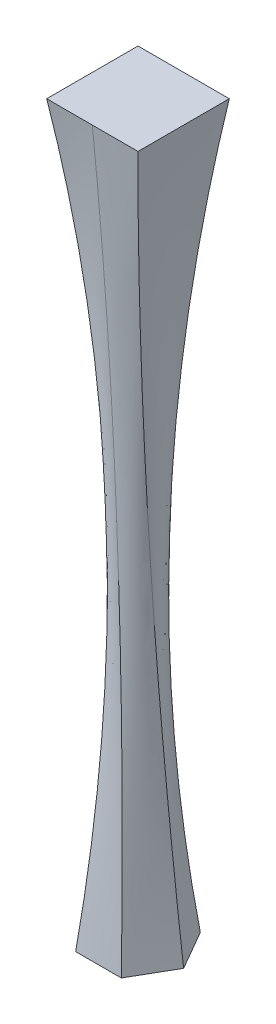
ISO-10303-21;
HEADER;
FILE_DESCRIPTION(('STEP AP214'),'2;1');
FILE_NAME('part.step','',(''),(''),'','','');
FILE_SCHEMA(('AUTOMOTIVE_DESIGN { 1 0 10303 214 1 1 1 1 }'));
ENDSEC;
DATA;
#1=APPLICATION_CONTEXT('core data for automotive mechanical design processes');
#2=APPLICATION_PROTOCOL_DEFINITION('international standard','automotive_design',2000,#1);
#3=PRODUCT_CONTEXT('',#1,'mechanical');
#4=PRODUCT('Part','Part','',(#3));
#5=PRODUCT_RELATED_PRODUCT_CATEGORY('part','',(#4));
#6=PRODUCT_DEFINITION_FORMATION('','',#4);
#7=PRODUCT_DEFINITION_CONTEXT('part definition',#1,'design');
#8=PRODUCT_DEFINITION('design','',#6,#7);
#9=PRODUCT_DEFINITION_SHAPE('','',#8);
#10=(LENGTH_UNIT() NAMED_UNIT(*) SI_UNIT(.MILLI.,.METRE.));
#11=(NAMED_UNIT(*) PLANE_ANGLE_UNIT() SI_UNIT($,.RADIAN.));
#12=(NAMED_UNIT(*) SI_UNIT($,.STERADIAN.) SOLID_ANGLE_UNIT());
#13=UNCERTAINTY_MEASURE_WITH_UNIT(LENGTH_MEASURE(1.E-05),#10,'distance_accuracy_value','');
#14=(GEOMETRIC_REPRESENTATION_CONTEXT(3) GLOBAL_UNCERTAINTY_ASSIGNED_CONTEXT((#13)) GLOBAL_UNIT_ASSIGNED_CONTEXT((#10,
#11,#12)) REPRESENTATION_CONTEXT('',''));
#15=CARTESIAN_POINT('',(0.,0.,0.));
#16=DIRECTION('',(0.,0.,1.));
#17=DIRECTION('',(1.,0.,0.));
#18=AXIS2_PLACEMENT_3D('',#15,#16,#17);
#19=CARTESIAN_POINT('',(0.,200.,0.));
#20=DIRECTION('',(0.,1.,0.));
#21=DIRECTION('',(0.,0.,1.));
#22=AXIS2_PLACEMENT_3D('',#19,#20,#21);
#23=PLANE('',#22);
#24=DIRECTION('',(0.,0.,-1.));
#25=VECTOR('',#24,1.);
#26=CARTESIAN_POINT('',(25.,200.,-25.));
#27=LINE('',#26,#25);
#28=CARTESIAN_POINT('',(25.,200.,25.));
#29=VERTEX_POINT('',#28);
#30=CARTESIAN_POINT('',(25.,200.,-25.));
#31=VERTEX_POINT('',#30);
#32=EDGE_CURVE('E132',#29,#31,#27,.T.);
#33=ORIENTED_EDGE('',*,*,#32,.T.);
#34=DIRECTION('',(-1.,0.,0.));
#35=VECTOR('',#34,1.);
#36=CARTESIAN_POINT('',(-25.,200.,-25.));
#37=LINE('',#36,#35);
#38=CARTESIAN_POINT('',(-1.59594559789866E-13,200.,-25.));
#39=VERTEX_POINT('',#38);
#40=EDGE_CURVE('E12',#31,#39,#37,.T.);
#41=ORIENTED_EDGE('',*,*,#40,.T.);
#42=CARTESIAN_POINT('',(-25.,200.,-25.));
#43=VERTEX_POINT('',#42);
#44=EDGE_CURVE('E57',#39,#43,#37,.T.);
#45=ORIENTED_EDGE('',*,*,#44,.T.);
#46=DIRECTION('',(0.,0.,1.));
#47=VECTOR('',#46,1.);
#48=CARTESIAN_POINT('',(-25.,200.,-25.));
#49=LINE('',#48,#47);
#50=CARTESIAN_POINT('',(-25.,200.,25.));
#51=VERTEX_POINT('',#50);
#52=EDGE_CURVE('E260',#43,#51,#49,.T.);
#53=ORIENTED_EDGE('',*,*,#52,.T.);
#54=DIRECTION('',(1.,0.,0.));
#55=VECTOR('',#54,1.);
#56=CARTESIAN_POINT('',(-25.,200.,25.));
#57=LINE('',#56,#55);
#58=CARTESIAN_POINT('',(0.,200.,25.));
#59=VERTEX_POINT('',#58);
#60=EDGE_CURVE('E65',#51,#59,#57,.T.);
#61=ORIENTED_EDGE('',*,*,#60,.T.);
#62=EDGE_CURVE('E135',#59,#29,#57,.T.);
#63=ORIENTED_EDGE('',*,*,#62,.T.);
#64=EDGE_LOOP('',(#33,#41,#45,#53,#61,#63));
#65=FACE_BOUND('',#64,.T.);
#66=ADVANCED_FACE('F47',(#65),#23,.T.);
#67=CARTESIAN_POINT('',(0.,-200.,0.));
#68=DIRECTION('',(0.,1.,0.));
#69=DIRECTION('',(0.,0.,1.));
#70=AXIS2_PLACEMENT_3D('',#67,#68,#69);
#71=PLANE('',#70);
#72=DIRECTION('',(0.499999999999995,0.,-0.866025403784442));
#73=VECTOR('',#72,1.);
#74=CARTESIAN_POINT('',(12.5000000000003,-200.,21.6506350946108));
#75=LINE('',#74,#73);
#76=CARTESIAN_POINT('',(12.5000000000003,-200.,21.6506350946108));
#77=VERTEX_POINT('',#76);
#78=CARTESIAN_POINT('',(25.,-200.,0.));
#79=VERTEX_POINT('',#78);
#80=EDGE_CURVE('E107',#77,#79,#75,.T.);
#81=ORIENTED_EDGE('',*,*,#80,.F.);
#82=DIRECTION('',(1.,0.,0.));
#83=VECTOR('',#82,1.);
#84=CARTESIAN_POINT('',(-12.4999999999998,-200.,21.6506350946111));
#85=LINE('',#84,#83);
#86=CARTESIAN_POINT('',(-12.4999999999998,-200.,21.6506350946111));
#87=VERTEX_POINT('',#86);
#88=EDGE_CURVE('E211',#87,#77,#85,.T.);
#89=ORIENTED_EDGE('',*,*,#88,.F.);
#90=DIRECTION('',(0.500000000000007,0.,0.866025403784435));
#91=VECTOR('',#90,1.);
#92=CARTESIAN_POINT('',(-25.,-200.,1.74574066942157E-13));
#93=LINE('',#92,#91);
#94=CARTESIAN_POINT('',(-25.,-200.,1.74574066942157E-13));
#95=VERTEX_POINT('',#94);
#96=EDGE_CURVE('E215',#95,#87,#93,.T.);
#97=ORIENTED_EDGE('',*,*,#96,.F.);
#98=DIRECTION('',(-0.499999999999995,0.,0.866025403784442));
#99=VECTOR('',#98,1.);
#100=CARTESIAN_POINT('',(-12.5000000000001,-200.,-21.6506350946109));
#101=LINE('',#100,#99);
#102=CARTESIAN_POINT('',(-12.5000000000001,-200.,-21.6506350946109));
#103=VERTEX_POINT('',#102);
#104=EDGE_CURVE('E319',#103,#95,#101,.T.);
#105=ORIENTED_EDGE('',*,*,#104,.F.);
#106=DIRECTION('',(-1.,0.,0.));
#107=VECTOR('',#106,1.);
#108=CARTESIAN_POINT('',(12.5,-200.,-21.650635094611));
#109=LINE('',#108,#107);
#110=CARTESIAN_POINT('',(12.5,-200.,-21.650635094611));
#111=VERTEX_POINT('',#110);
#112=EDGE_CURVE('E110',#111,#103,#109,.T.);
#113=ORIENTED_EDGE('',*,*,#112,.F.);
#114=DIRECTION('',(-0.500000000000001,0.,-0.866025403784438));
#115=VECTOR('',#114,1.);
#116=CARTESIAN_POINT('',(25.,-200.,0.));
#117=LINE('',#116,#115);
#118=EDGE_CURVE('E103',#79,#111,#117,.T.);
#119=ORIENTED_EDGE('',*,*,#118,.F.);
#120=EDGE_LOOP('',(#81,#89,#97,#105,#113,#119));
#121=FACE_BOUND('',#120,.T.);
#122=ADVANCED_FACE('F106',(#121),#71,.F.);
#123=CARTESIAN_POINT('',(12.5,-200.,-21.650635094611));
#124=CARTESIAN_POINT('',(8.92320177032487,-133.199819300362,-11.4260780027468));
#125=CARTESIAN_POINT('',(7.42464819524794,0.104334544871534,-1.75837751612293));
#126=CARTESIAN_POINT('',(17.2565351036582,133.466847366305,-13.6589879396728));
#127=CARTESIAN_POINT('',(25.,200.,-25.));
#128=CARTESIAN_POINT('',(4.1666666666666,-200.,-21.650635094611));
#129=CARTESIAN_POINT('',(3.62858929019053,-133.252205813714,-12.6045499883517));
#130=CARTESIAN_POINT('',(7.61149610460513,0.15672114157544,-7.90531686988969));
#131=CARTESIAN_POINT('',(11.9619226235239,133.414460852952,-14.8374599252777));
#132=CARTESIAN_POINT('',(16.6666666666666,200.,-25.));
#133=CARTESIAN_POINT('',(-4.16666666666675,-200.,-21.6506350946109));
#134=CARTESIAN_POINT('',(-1.6660231899438,-133.304592327067,-13.7830219739565));
#135=CARTESIAN_POINT('',(4.27497381541747,0.209107738279319,-10.772388554184));
#136=CARTESIAN_POINT('',(6.66731014338952,133.3620743396,-16.0159319108826));
#137=CARTESIAN_POINT('',(8.33333333333323,200.,-25.));
#138=CARTESIAN_POINT('',(-12.5000000000001,-200.,-21.6506350946109));
#139=CARTESIAN_POINT('',(-6.96063567007813,-133.356978840419,-14.9614939595614));
#140=CARTESIAN_POINT('',(0.671714285350042,0.261494334983225,-8.83316013033138));
#141=CARTESIAN_POINT('',(1.37269766325516,133.309687826248,-17.1944038964875));
#142=CARTESIAN_POINT('',(-1.59594559789866E-13,200.,-25.));
#143=B_SPLINE_SURFACE_WITH_KNOTS('',3,3,((#123,#124,#125,#126,#127),(#128,#129,#130,#131,#132),
(#133,#134,#135,#136,#137),(#138,#139,#140,#141,#142)),.UNSPECIFIED.,.F.,.F.,.F.,(4,4),(4,1,4),
(0.,1.),(0.,0.499554033873019,1.),.UNSPECIFIED.);
#144=CARTESIAN_POINT('',(-12.5000000000001,-200.,-21.6506350946109));
#145=CARTESIAN_POINT('',(-6.96063567007813,-133.356978840419,-14.9614939595614));
#146=CARTESIAN_POINT('',(0.671714285350042,0.261494334983225,-8.83316013033138));
#147=CARTESIAN_POINT('',(1.37269766325516,133.309687826248,-17.1944038964875));
#148=CARTESIAN_POINT('',(-1.59594559789866E-13,200.,-25.));
#149=B_SPLINE_CURVE_WITH_KNOTS('',3,(#144,#145,#146,#147,#148),.UNSPECIFIED.,.F.,.F.,(4,1,4),
(0.,0.499554033873019,1.),.UNSPECIFIED.);
#150=EDGE_CURVE('E302',#103,#39,#149,.T.);
#151=CARTESIAN_POINT('',(12.5,-200.,-21.650635094611));
#152=CARTESIAN_POINT('',(8.92320177032487,-133.199819300362,-11.4260780027468));
#153=CARTESIAN_POINT('',(7.42464819524794,0.104334544871534,-1.75837751612293));
#154=CARTESIAN_POINT('',(17.2565351036582,133.466847366305,-13.6589879396728));
#155=CARTESIAN_POINT('',(25.,200.,-25.));
#156=B_SPLINE_CURVE_WITH_KNOTS('',3,(#151,#152,#153,#154,#155),.UNSPECIFIED.,.F.,.F.,(4,1,4),
(0.,0.499554033873019,1.),.UNSPECIFIED.);
#157=EDGE_CURVE('E153',#31,#111,#156,.F.);
#158=ORIENTED_EDGE('',*,*,#112,.T.);
#159=ORIENTED_EDGE('',*,*,#150,.T.);
#160=ORIENTED_EDGE('',*,*,#40,.F.);
#161=ORIENTED_EDGE('',*,*,#157,.T.);
#162=EDGE_LOOP('',(#158,#159,#160,#161));
#163=FACE_BOUND('',#162,.T.);
#164=ADVANCED_FACE('F278',(#163),#143,.T.);
#165=CARTESIAN_POINT('',(-12.5000000000001,-200.,-21.6506350946109));
#166=CARTESIAN_POINT('',(-6.96063567007813,-133.356978840419,-14.9614939595614));
#167=CARTESIAN_POINT('',(0.671714285350042,0.261494334983225,-8.83316013033138));
#168=CARTESIAN_POINT('',(1.37269766325516,133.309687826248,-17.1944038964875));
#169=CARTESIAN_POINT('',(-1.59594559789866E-13,200.,-25.));
#170=CARTESIAN_POINT('',(-16.6666666666667,-200.,-14.4337567297405));
#171=CARTESIAN_POINT('',(-9.93339918164415,-133.29932682143,-9.76746169341948));
#172=CARTESIAN_POINT('',(-3.86698440038327,0.203842224265202,-10.8651074627243));
#173=CARTESIAN_POINT('',(-4.37784362608862,133.367339845236,-16.8116238735924));
#174=CARTESIAN_POINT('',(-8.33333333333344,200.,-25.));
#175=CARTESIAN_POINT('',(-20.8333333333334,-200.,-7.21687836487019));
#176=CARTESIAN_POINT('',(-12.9061626932102,-133.241674802442,-4.57342942727751));
#177=CARTESIAN_POINT('',(-7.3269194625746,0.146190113547194,-8.20579286150414));
#178=CARTESIAN_POINT('',(-10.1283849154324,133.424991864225,-16.4288438506974));
#179=CARTESIAN_POINT('',(-16.6666666666667,200.,-25.));
#180=CARTESIAN_POINT('',(-25.,-200.,1.76941794549634E-13));
#181=CARTESIAN_POINT('',(-15.8789262047762,-133.184022783453,0.620602838864446));
#182=CARTESIAN_POINT('',(-6.75784515333883,0.0885380028291718,-2.91232697947338));
#183=CARTESIAN_POINT('',(-15.8789262047762,133.482643883213,-16.0460638278023));
#184=CARTESIAN_POINT('',(-25.,200.,-25.));
#185=B_SPLINE_SURFACE_WITH_KNOTS('',3,3,((#165,#166,#167,#168,#169),(#170,#171,#172,#173,#174),
(#175,#176,#177,#178,#179),(#180,#181,#182,#183,#184)),.UNSPECIFIED.,.F.,.F.,.F.,(4,4),(4,1,4),
(0.,1.),(0.,0.499554033873019,1.),.UNSPECIFIED.);
#186=CARTESIAN_POINT('',(-25.,-200.,1.76941794549634E-13));
#187=CARTESIAN_POINT('',(-15.8789262047762,-133.184022783453,0.620602838864446));
#188=CARTESIAN_POINT('',(-6.75784515333883,0.0885380028291718,-2.91232697947338));
#189=CARTESIAN_POINT('',(-15.8789262047762,133.482643883213,-16.0460638278023));
#190=CARTESIAN_POINT('',(-25.,200.,-25.));
#191=B_SPLINE_CURVE_WITH_KNOTS('',3,(#186,#187,#188,#189,#190),.UNSPECIFIED.,.F.,.F.,(4,1,4),
(0.,0.499554033873019,1.),.UNSPECIFIED.);
#192=EDGE_CURVE('E309',#95,#43,#191,.T.);
#193=ORIENTED_EDGE('',*,*,#104,.T.);
#194=ORIENTED_EDGE('',*,*,#192,.T.);
#195=ORIENTED_EDGE('',*,*,#44,.F.);
#196=ORIENTED_EDGE('',*,*,#150,.F.);
#197=EDGE_LOOP('',(#193,#194,#195,#196));
#198=FACE_BOUND('',#197,.T.);
#199=ADVANCED_FACE('F167',(#198),#185,.T.);
#200=CARTESIAN_POINT('',(25.,-200.,0.));
#201=CARTESIAN_POINT('',(15.8789262047762,-133.184022783453,-0.620602838864391));
#202=CARTESIAN_POINT('',(6.75784515333886,0.0885380028291718,2.91232697947328));
#203=CARTESIAN_POINT('',(15.8789262047762,133.482643883213,16.0460638278023));
#204=CARTESIAN_POINT('',(25.,200.,25.));
#205=CARTESIAN_POINT('',(20.8333333333333,-200.,-7.21687836487033));
#206=CARTESIAN_POINT('',(13.5603513932924,-133.189288289089,-4.22242789349185));
#207=CARTESIAN_POINT('',(11.4801175861354,0.0938035168433017,1.57230538125624));
#208=CARTESIAN_POINT('',(16.3381291710702,133.477378377577,6.1443799053106));
#209=CARTESIAN_POINT('',(25.,200.,8.33333333333333));
#210=CARTESIAN_POINT('',(16.6666666666666,-200.,-14.4337567297407));
#211=CARTESIAN_POINT('',(11.2417765818086,-133.194553794726,-7.8242529481193));
#212=CARTESIAN_POINT('',(11.6002561968452,0.0990690308574178,-1.17911048110144));
#213=CARTESIAN_POINT('',(16.7973321373642,133.472112871941,-3.75730401718108));
#214=CARTESIAN_POINT('',(25.,200.,-8.33333333333333));
#215=CARTESIAN_POINT('',(12.5,-200.,-21.650635094611));
#216=CARTESIAN_POINT('',(8.92320177032487,-133.199819300362,-11.4260780027468));
#217=CARTESIAN_POINT('',(7.42464819524794,0.104334544871534,-1.75837751612293));
#218=CARTESIAN_POINT('',(17.2565351036582,133.466847366305,-13.6589879396728));
#219=CARTESIAN_POINT('',(25.,200.,-25.));
#220=B_SPLINE_SURFACE_WITH_KNOTS('',3,3,((#200,#201,#202,#203,#204),(#205,#206,#207,#208,#209),
(#210,#211,#212,#213,#214),(#215,#216,#217,#218,#219)),.UNSPECIFIED.,.F.,.F.,.F.,(4,4),(4,1,4),
(0.,1.),(0.,0.499554033873019,1.),.UNSPECIFIED.);
#221=CARTESIAN_POINT('',(25.,-200.,0.));
#222=CARTESIAN_POINT('',(15.8789262047762,-133.184022783453,-0.620602838864391));
#223=CARTESIAN_POINT('',(6.75784515333886,0.0885380028291718,2.91232697947328));
#224=CARTESIAN_POINT('',(15.8789262047762,133.482643883213,16.0460638278023));
#225=CARTESIAN_POINT('',(25.,200.,25.));
#226=B_SPLINE_CURVE_WITH_KNOTS('',3,(#221,#222,#223,#224,#225),.UNSPECIFIED.,.F.,.F.,(4,1,4),
(0.,0.499554033873019,1.),.UNSPECIFIED.);
#227=EDGE_CURVE('E123',#79,#29,#226,.T.);
#228=ORIENTED_EDGE('',*,*,#118,.T.);
#229=ORIENTED_EDGE('',*,*,#157,.F.);
#230=ORIENTED_EDGE('',*,*,#32,.F.);
#231=ORIENTED_EDGE('',*,*,#227,.F.);
#232=EDGE_LOOP('',(#228,#229,#230,#231));
#233=FACE_BOUND('',#232,.T.);
#234=ADVANCED_FACE('F131',(#233),#220,.T.);
#235=CARTESIAN_POINT('',(-25.,-200.,1.74574066942157E-13));
#236=CARTESIAN_POINT('',(-15.8789262047762,-133.184022783453,0.620602838864444));
#237=CARTESIAN_POINT('',(-6.75784515333882,0.0885380028291718,-2.91232697947338));
#238=CARTESIAN_POINT('',(-15.8789262047762,133.482643883213,-16.0460638278023));
#239=CARTESIAN_POINT('',(-25.,200.,-25.));
#240=CARTESIAN_POINT('',(-20.8333333333333,-200.,7.21687836487048));
#241=CARTESIAN_POINT('',(-13.5603513932924,-133.189288289089,4.22242789349189));
#242=CARTESIAN_POINT('',(-11.4801175861354,0.0938035168433017,-1.57230538125634));
#243=CARTESIAN_POINT('',(-16.3381291710702,133.477378377577,-6.14437990531065));
#244=CARTESIAN_POINT('',(-25.,200.,-8.33333333333333));
#245=CARTESIAN_POINT('',(-16.6666666666665,-200.,14.4337567297408));
#246=CARTESIAN_POINT('',(-11.2417765818086,-133.194553794726,7.82425294811934));
#247=CARTESIAN_POINT('',(-11.6002561968452,0.0990690308574178,1.17911048110136));
#248=CARTESIAN_POINT('',(-16.7973321373642,133.472112871941,3.75730401718104));
#249=CARTESIAN_POINT('',(-25.,200.,8.33333333333333));
#250=CARTESIAN_POINT('',(-12.4999999999998,-200.,21.6506350946111));
#251=CARTESIAN_POINT('',(-8.9232017703248,-133.199819300362,11.4260780027468));
#252=CARTESIAN_POINT('',(-7.424648195248,0.104334544871534,1.75837751612287));
#253=CARTESIAN_POINT('',(-17.2565351036583,133.466847366305,13.6589879396727));
#254=CARTESIAN_POINT('',(-25.,200.,25.));
#255=B_SPLINE_SURFACE_WITH_KNOTS('',3,3,((#235,#236,#237,#238,#239),(#240,#241,#242,#243,#244),
(#245,#246,#247,#248,#249),(#250,#251,#252,#253,#254)),.UNSPECIFIED.,.F.,.F.,.F.,(4,4),(4,1,4),
(0.,1.),(0.,0.499554033873019,1.),.UNSPECIFIED.);
#256=CARTESIAN_POINT('',(-12.4999999999998,-200.,21.6506350946111));
#257=CARTESIAN_POINT('',(-8.9232017703248,-133.199819300362,11.4260780027468));
#258=CARTESIAN_POINT('',(-7.424648195248,0.104334544871534,1.75837751612287));
#259=CARTESIAN_POINT('',(-17.2565351036583,133.466847366305,13.6589879396727));
#260=CARTESIAN_POINT('',(-25.,200.,25.));
#261=B_SPLINE_CURVE_WITH_KNOTS('',3,(#256,#257,#258,#259,#260),.UNSPECIFIED.,.F.,.F.,(4,1,4),
(0.,0.499554033873019,1.),.UNSPECIFIED.);
#262=EDGE_CURVE('E137',#87,#51,#261,.T.);
#263=ORIENTED_EDGE('',*,*,#96,.T.);
#264=ORIENTED_EDGE('',*,*,#262,.T.);
#265=ORIENTED_EDGE('',*,*,#52,.F.);
#266=ORIENTED_EDGE('',*,*,#192,.F.);
#267=EDGE_LOOP('',(#263,#264,#265,#266));
#268=FACE_BOUND('',#267,.T.);
#269=ADVANCED_FACE('F166',(#268),#255,.T.);
#270=CARTESIAN_POINT('',(-12.4999999999998,-200.,21.6506350946111));
#271=CARTESIAN_POINT('',(-8.9232017703248,-133.199819300362,11.4260780027468));
#272=CARTESIAN_POINT('',(-7.424648195248,0.104334544871534,1.75837751612287));
#273=CARTESIAN_POINT('',(-17.2565351036583,133.466847366305,13.6589879396727));
#274=CARTESIAN_POINT('',(-25.,200.,25.));
#275=CARTESIAN_POINT('',(-4.16666666666645,-200.,21.650635094611));
#276=CARTESIAN_POINT('',(-3.62858929019047,-133.252205813714,12.6045499883517));
#277=CARTESIAN_POINT('',(-7.6114961046052,0.15672114157544,7.90531686988964));
#278=CARTESIAN_POINT('',(-11.9619226235239,133.414460852952,14.8374599252777));
#279=CARTESIAN_POINT('',(-16.6666666666667,200.,25.));
#280=CARTESIAN_POINT('',(4.1666666666669,-200.,21.6506350946109));
#281=CARTESIAN_POINT('',(1.66602318994386,-133.304592327067,13.7830219739565));
#282=CARTESIAN_POINT('',(-4.27497381541755,0.209107738279319,10.7723885541839));
#283=CARTESIAN_POINT('',(-6.66731014338962,133.3620743396,16.0159319108826));
#284=CARTESIAN_POINT('',(-8.33333333333333,200.,25.));
#285=CARTESIAN_POINT('',(12.5000000000003,-200.,21.6506350946108));
#286=CARTESIAN_POINT('',(6.9606356700782,-133.356978840419,14.9614939595614));
#287=CARTESIAN_POINT('',(-0.671714285350118,0.261494334983225,8.83316013033139));
#288=CARTESIAN_POINT('',(-1.3726976632553,133.309687826248,17.1944038964875));
#289=CARTESIAN_POINT('',(0.,200.,25.));
#290=B_SPLINE_SURFACE_WITH_KNOTS('',3,3,((#270,#271,#272,#273,#274),(#275,#276,#277,#278,#279),
(#280,#281,#282,#283,#284),(#285,#286,#287,#288,#289)),.UNSPECIFIED.,.F.,.F.,.F.,(4,4),(4,1,4),
(0.,1.),(0.,0.499554033873019,1.),.UNSPECIFIED.);
#291=CARTESIAN_POINT('',(12.5000000000003,-200.,21.6506350946108));
#292=CARTESIAN_POINT('',(6.9606356700782,-133.356978840419,14.9614939595614));
#293=CARTESIAN_POINT('',(-0.671714285350118,0.261494334983225,8.83316013033139));
#294=CARTESIAN_POINT('',(-1.3726976632553,133.309687826248,17.1944038964875));
#295=CARTESIAN_POINT('',(0.,200.,25.));
#296=B_SPLINE_CURVE_WITH_KNOTS('',3,(#291,#292,#293,#294,#295),.UNSPECIFIED.,.F.,.F.,(4,1,4),
(0.,0.499554033873019,1.),.UNSPECIFIED.);
#297=EDGE_CURVE('E125',#77,#59,#296,.T.);
#298=ORIENTED_EDGE('',*,*,#88,.T.);
#299=ORIENTED_EDGE('',*,*,#297,.T.);
#300=ORIENTED_EDGE('',*,*,#60,.F.);
#301=ORIENTED_EDGE('',*,*,#262,.F.);
#302=EDGE_LOOP('',(#298,#299,#300,#301));
#303=FACE_BOUND('',#302,.T.);
#304=ADVANCED_FACE('F207',(#303),#290,.T.);
#305=CARTESIAN_POINT('',(12.5000000000003,-200.,21.6506350946108));
#306=CARTESIAN_POINT('',(6.9606356700782,-133.356978840419,14.9614939595614));
#307=CARTESIAN_POINT('',(-0.671714285350114,0.261494334983225,8.8331601303314));
#308=CARTESIAN_POINT('',(-1.3726976632553,133.309687826248,17.1944038964875));
#309=CARTESIAN_POINT('',(0.,200.,25.));
#310=CARTESIAN_POINT('',(16.6666666666668,-200.,14.4337567297405));
#311=CARTESIAN_POINT('',(9.93339918164419,-133.29932682143,9.76746169341947));
#312=CARTESIAN_POINT('',(3.86698440038326,0.203842224265202,10.8651074627243));
#313=CARTESIAN_POINT('',(4.37784362608853,133.367339845236,16.8116238735924));
#314=CARTESIAN_POINT('',(8.33333333333334,200.,25.));
#315=CARTESIAN_POINT('',(20.8333333333334,-200.,7.21687836487027));
#316=CARTESIAN_POINT('',(12.9061626932102,-133.241674802442,4.57342942727754));
#317=CARTESIAN_POINT('',(7.32691946257465,0.146190113547194,8.20579286150413));
#318=CARTESIAN_POINT('',(10.1283849154324,133.424991864225,16.4288438506974));
#319=CARTESIAN_POINT('',(16.6666666666667,200.,25.));
#320=CARTESIAN_POINT('',(25.,-200.,0.));
#321=CARTESIAN_POINT('',(15.8789262047762,-133.184022783453,-0.620602838864391));
#322=CARTESIAN_POINT('',(6.75784515333886,0.0885380028291718,2.91232697947328));
#323=CARTESIAN_POINT('',(15.8789262047762,133.482643883213,16.0460638278023));
#324=CARTESIAN_POINT('',(25.,200.,25.));
#325=B_SPLINE_SURFACE_WITH_KNOTS('',3,3,((#305,#306,#307,#308,#309),(#310,#311,#312,#313,#314),
(#315,#316,#317,#318,#319),(#320,#321,#322,#323,#324)),.UNSPECIFIED.,.F.,.F.,.F.,(4,4),(4,1,4),
(0.,1.),(0.,0.499554033873019,1.),.UNSPECIFIED.);
#326=ORIENTED_EDGE('',*,*,#80,.T.);
#327=ORIENTED_EDGE('',*,*,#227,.T.);
#328=ORIENTED_EDGE('',*,*,#62,.F.);
#329=ORIENTED_EDGE('',*,*,#297,.F.);
#330=EDGE_LOOP('',(#326,#327,#328,#329));
#331=FACE_BOUND('',#330,.T.);
#332=ADVANCED_FACE('F122',(#331),#325,.T.);
#333=CLOSED_SHELL('',(#66,#122,#164,#199,#234,#269,#304,#332));
#334=MANIFOLD_SOLID_BREP('B2',#333);
#335=ADVANCED_BREP_SHAPE_REPRESENTATION('',(#18,#334),#14);
#336=SHAPE_DEFINITION_REPRESENTATION(#9,#335);
ENDSEC;
END-ISO-10303-21;
